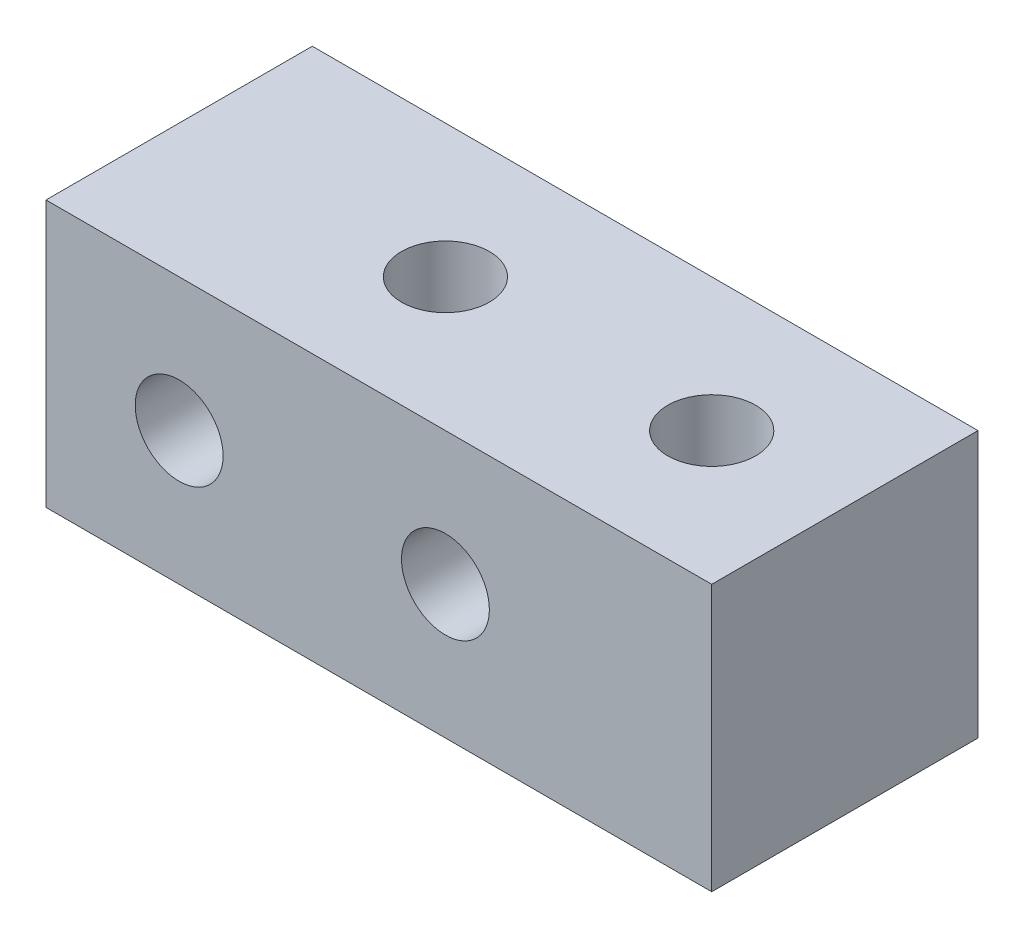
ISO-10303-21;
HEADER;
FILE_DESCRIPTION(('STEP AP214'),'2;1');
FILE_NAME('part.step','',(''),(''),'','','');
FILE_SCHEMA(('AUTOMOTIVE_DESIGN { 1 0 10303 214 1 1 1 1 }'));
ENDSEC;
DATA;
#1=APPLICATION_CONTEXT('core data for automotive mechanical design processes');
#2=APPLICATION_PROTOCOL_DEFINITION('international standard','automotive_design',2000,#1);
#3=PRODUCT_CONTEXT('',#1,'mechanical');
#4=PRODUCT('Part','Part','',(#3));
#5=PRODUCT_RELATED_PRODUCT_CATEGORY('part','',(#4));
#6=PRODUCT_DEFINITION_FORMATION('','',#4);
#7=PRODUCT_DEFINITION_CONTEXT('part definition',#1,'design');
#8=PRODUCT_DEFINITION('design','',#6,#7);
#9=PRODUCT_DEFINITION_SHAPE('','',#8);
#10=(LENGTH_UNIT() NAMED_UNIT(*) SI_UNIT(.MILLI.,.METRE.));
#11=(NAMED_UNIT(*) PLANE_ANGLE_UNIT() SI_UNIT($,.RADIAN.));
#12=(NAMED_UNIT(*) SI_UNIT($,.STERADIAN.) SOLID_ANGLE_UNIT());
#13=UNCERTAINTY_MEASURE_WITH_UNIT(LENGTH_MEASURE(1.E-05),#10,'distance_accuracy_value','');
#14=(GEOMETRIC_REPRESENTATION_CONTEXT(3) GLOBAL_UNCERTAINTY_ASSIGNED_CONTEXT((#13)) GLOBAL_UNIT_ASSIGNED_CONTEXT((#10,
#11,#12)) REPRESENTATION_CONTEXT('',''));
#15=CARTESIAN_POINT('',(0.,0.,0.));
#16=DIRECTION('',(0.,0.,1.));
#17=DIRECTION('',(1.,0.,0.));
#18=AXIS2_PLACEMENT_3D('',#15,#16,#17);
#19=CARTESIAN_POINT('',(-12.5,-5.,10.));
#20=DIRECTION('',(1.,0.,0.));
#21=DIRECTION('',(0.,0.,-1.));
#22=AXIS2_PLACEMENT_3D('',#19,#20,#21);
#23=PLANE('',#22);
#24=DIRECTION('',(0.,-1.,0.));
#25=VECTOR('',#24,1.);
#26=CARTESIAN_POINT('',(-12.5,-5.,0.));
#27=LINE('',#26,#25);
#28=CARTESIAN_POINT('',(-12.5,5.,0.));
#29=VERTEX_POINT('',#28);
#30=CARTESIAN_POINT('',(-12.5,-5.,0.));
#31=VERTEX_POINT('',#30);
#32=EDGE_CURVE('E99',#29,#31,#27,.T.);
#33=ORIENTED_EDGE('',*,*,#32,.T.);
#34=DIRECTION('',(0.,0.,-1.));
#35=VECTOR('',#34,1.);
#36=CARTESIAN_POINT('',(-12.5,-5.,10.));
#37=LINE('',#36,#35);
#38=CARTESIAN_POINT('',(-12.5,-5.,10.));
#39=VERTEX_POINT('',#38);
#40=EDGE_CURVE('E11',#39,#31,#37,.T.);
#41=ORIENTED_EDGE('',*,*,#40,.F.);
#42=DIRECTION('',(0.,-1.,0.));
#43=VECTOR('',#42,1.);
#44=CARTESIAN_POINT('',(-12.5,-5.,10.));
#45=LINE('',#44,#43);
#46=CARTESIAN_POINT('',(-12.5,5.,10.));
#47=VERTEX_POINT('',#46);
#48=EDGE_CURVE('E87',#47,#39,#45,.T.);
#49=ORIENTED_EDGE('',*,*,#48,.F.);
#50=DIRECTION('',(0.,0.,-1.));
#51=VECTOR('',#50,1.);
#52=CARTESIAN_POINT('',(-12.5,5.,10.));
#53=LINE('',#52,#51);
#54=EDGE_CURVE('E95',#47,#29,#53,.T.);
#55=ORIENTED_EDGE('',*,*,#54,.T.);
#56=EDGE_LOOP('',(#33,#41,#49,#55));
#57=FACE_BOUND('',#56,.T.);
#58=ADVANCED_FACE('F36',(#57),#23,.F.);
#59=CARTESIAN_POINT('',(12.5,-5.,10.));
#60=DIRECTION('',(0.,1.,0.));
#61=DIRECTION('',(-1.,0.,0.));
#62=AXIS2_PLACEMENT_3D('',#59,#60,#61);
#63=PLANE('',#62);
#64=CARTESIAN_POINT('',(-2.5,-5.,5.));
#65=DIRECTION('',(0.,1.,0.));
#66=DIRECTION('',(0.,0.,1.));
#67=AXIS2_PLACEMENT_3D('',#64,#65,#66);
#68=CIRCLE('',#67,1.65);
#69=CARTESIAN_POINT('',(-2.5,-5.,6.65));
#70=VERTEX_POINT('',#69);
#71=EDGE_CURVE('E130',#70,#70,#68,.T.);
#72=ORIENTED_EDGE('',*,*,#71,.T.);
#73=EDGE_LOOP('',(#72));
#74=FACE_BOUND('',#73,.T.);
#75=CARTESIAN_POINT('',(7.5,-5.,5.));
#76=DIRECTION('',(0.,1.,0.));
#77=DIRECTION('',(0.,0.,1.));
#78=AXIS2_PLACEMENT_3D('',#75,#76,#77);
#79=CIRCLE('',#78,1.65);
#80=CARTESIAN_POINT('',(7.5,-5.,6.65));
#81=VERTEX_POINT('',#80);
#82=EDGE_CURVE('E124',#81,#81,#79,.T.);
#83=ORIENTED_EDGE('',*,*,#82,.T.);
#84=EDGE_LOOP('',(#83));
#85=FACE_BOUND('',#84,.T.);
#86=DIRECTION('',(1.,0.,0.));
#87=VECTOR('',#86,1.);
#88=CARTESIAN_POINT('',(12.5,-5.,0.));
#89=LINE('',#88,#87);
#90=CARTESIAN_POINT('',(12.5,-5.,0.));
#91=VERTEX_POINT('',#90);
#92=EDGE_CURVE('E91',#31,#91,#89,.T.);
#93=ORIENTED_EDGE('',*,*,#92,.T.);
#94=DIRECTION('',(0.,0.,-1.));
#95=VECTOR('',#94,1.);
#96=CARTESIAN_POINT('',(12.5,-5.,10.));
#97=LINE('',#96,#95);
#98=CARTESIAN_POINT('',(12.5,-5.,10.));
#99=VERTEX_POINT('',#98);
#100=EDGE_CURVE('E44',#99,#91,#97,.T.);
#101=ORIENTED_EDGE('',*,*,#100,.F.);
#102=DIRECTION('',(1.,0.,0.));
#103=VECTOR('',#102,1.);
#104=CARTESIAN_POINT('',(12.5,-5.,10.));
#105=LINE('',#104,#103);
#106=EDGE_CURVE('E82',#39,#99,#105,.T.);
#107=ORIENTED_EDGE('',*,*,#106,.F.);
#108=ORIENTED_EDGE('',*,*,#40,.T.);
#109=EDGE_LOOP('',(#93,#101,#107,#108));
#110=FACE_BOUND('',#109,.T.);
#111=ADVANCED_FACE('F90',(#74,#85,#110),#63,.F.);
#112=CARTESIAN_POINT('',(12.5,-5.,10.));
#113=DIRECTION('',(-1.,0.,0.));
#114=DIRECTION('',(0.,0.,1.));
#115=AXIS2_PLACEMENT_3D('',#112,#113,#114);
#116=PLANE('',#115);
#117=DIRECTION('',(0.,1.,0.));
#118=VECTOR('',#117,1.);
#119=CARTESIAN_POINT('',(12.5,-5.,0.));
#120=LINE('',#119,#118);
#121=CARTESIAN_POINT('',(12.5,5.,0.));
#122=VERTEX_POINT('',#121);
#123=EDGE_CURVE('E69',#91,#122,#120,.T.);
#124=ORIENTED_EDGE('',*,*,#123,.T.);
#125=DIRECTION('',(0.,0.,-1.));
#126=VECTOR('',#125,1.);
#127=CARTESIAN_POINT('',(12.5,5.,10.));
#128=LINE('',#127,#126);
#129=CARTESIAN_POINT('',(12.5,5.,10.));
#130=VERTEX_POINT('',#129);
#131=EDGE_CURVE('E92',#130,#122,#128,.T.);
#132=ORIENTED_EDGE('',*,*,#131,.F.);
#133=DIRECTION('',(0.,1.,0.));
#134=VECTOR('',#133,1.);
#135=CARTESIAN_POINT('',(12.5,-5.,10.));
#136=LINE('',#135,#134);
#137=EDGE_CURVE('E85',#99,#130,#136,.T.);
#138=ORIENTED_EDGE('',*,*,#137,.F.);
#139=ORIENTED_EDGE('',*,*,#100,.T.);
#140=EDGE_LOOP('',(#124,#132,#138,#139));
#141=FACE_BOUND('',#140,.T.);
#142=ADVANCED_FACE('F93',(#141),#116,.F.);
#143=CARTESIAN_POINT('',(12.5,5.,10.));
#144=DIRECTION('',(0.,-1.,0.));
#145=DIRECTION('',(1.,0.,0.));
#146=AXIS2_PLACEMENT_3D('',#143,#144,#145);
#147=PLANE('',#146);
#148=CARTESIAN_POINT('',(-2.5,5.,5.));
#149=DIRECTION('',(0.,1.,0.));
#150=DIRECTION('',(0.,0.,1.));
#151=AXIS2_PLACEMENT_3D('',#148,#149,#150);
#152=CIRCLE('',#151,1.65);
#153=CARTESIAN_POINT('',(-2.5,5.,6.65));
#154=VERTEX_POINT('',#153);
#155=EDGE_CURVE('E133',#154,#154,#152,.T.);
#156=ORIENTED_EDGE('',*,*,#155,.F.);
#157=EDGE_LOOP('',(#156));
#158=FACE_BOUND('',#157,.T.);
#159=CARTESIAN_POINT('',(7.5,5.,5.));
#160=DIRECTION('',(0.,1.,0.));
#161=DIRECTION('',(0.,0.,1.));
#162=AXIS2_PLACEMENT_3D('',#159,#160,#161);
#163=CIRCLE('',#162,1.65);
#164=CARTESIAN_POINT('',(7.5,5.,6.65));
#165=VERTEX_POINT('',#164);
#166=EDGE_CURVE('E127',#165,#165,#163,.T.);
#167=ORIENTED_EDGE('',*,*,#166,.F.);
#168=EDGE_LOOP('',(#167));
#169=FACE_BOUND('',#168,.T.);
#170=DIRECTION('',(-1.,0.,0.));
#171=VECTOR('',#170,1.);
#172=CARTESIAN_POINT('',(12.5,5.,0.));
#173=LINE('',#172,#171);
#174=EDGE_CURVE('E75',#122,#29,#173,.T.);
#175=ORIENTED_EDGE('',*,*,#174,.T.);
#176=ORIENTED_EDGE('',*,*,#54,.F.);
#177=DIRECTION('',(-1.,0.,0.));
#178=VECTOR('',#177,1.);
#179=CARTESIAN_POINT('',(12.5,5.,10.));
#180=LINE('',#179,#178);
#181=EDGE_CURVE('E52',#130,#47,#180,.T.);
#182=ORIENTED_EDGE('',*,*,#181,.F.);
#183=ORIENTED_EDGE('',*,*,#131,.T.);
#184=EDGE_LOOP('',(#175,#176,#182,#183));
#185=FACE_BOUND('',#184,.T.);
#186=ADVANCED_FACE('F107',(#158,#169,#185),#147,.F.);
#187=CARTESIAN_POINT('',(0.,0.,10.));
#188=DIRECTION('',(0.,0.,1.));
#189=DIRECTION('',(1.,0.,0.));
#190=AXIS2_PLACEMENT_3D('',#187,#188,#189);
#191=PLANE('',#190);
#192=CARTESIAN_POINT('',(2.5,0.,10.));
#193=DIRECTION('',(0.,0.,1.));
#194=DIRECTION('',(1.,0.,0.));
#195=AXIS2_PLACEMENT_3D('',#192,#193,#194);
#196=CIRCLE('',#195,1.65);
#197=CARTESIAN_POINT('',(4.15,0.,10.));
#198=VERTEX_POINT('',#197);
#199=EDGE_CURVE('E121',#198,#198,#196,.T.);
#200=ORIENTED_EDGE('',*,*,#199,.F.);
#201=EDGE_LOOP('',(#200));
#202=FACE_BOUND('',#201,.T.);
#203=CARTESIAN_POINT('',(-7.5,0.,10.));
#204=DIRECTION('',(0.,0.,1.));
#205=DIRECTION('',(1.,0.,0.));
#206=AXIS2_PLACEMENT_3D('',#203,#204,#205);
#207=CIRCLE('',#206,1.65);
#208=CARTESIAN_POINT('',(-5.85,0.,10.));
#209=VERTEX_POINT('',#208);
#210=EDGE_CURVE('E115',#209,#209,#207,.T.);
#211=ORIENTED_EDGE('',*,*,#210,.F.);
#212=EDGE_LOOP('',(#211));
#213=FACE_BOUND('',#212,.T.);
#214=ORIENTED_EDGE('',*,*,#48,.T.);
#215=ORIENTED_EDGE('',*,*,#106,.T.);
#216=ORIENTED_EDGE('',*,*,#137,.T.);
#217=ORIENTED_EDGE('',*,*,#181,.T.);
#218=EDGE_LOOP('',(#214,#215,#216,#217));
#219=FACE_BOUND('',#218,.T.);
#220=ADVANCED_FACE('F83',(#202,#213,#219),#191,.T.);
#221=CARTESIAN_POINT('',(0.,0.,0.));
#222=DIRECTION('',(0.,0.,1.));
#223=DIRECTION('',(1.,0.,0.));
#224=AXIS2_PLACEMENT_3D('',#221,#222,#223);
#225=PLANE('',#224);
#226=CARTESIAN_POINT('',(2.5,0.,0.));
#227=DIRECTION('',(0.,0.,1.));
#228=DIRECTION('',(1.,0.,0.));
#229=AXIS2_PLACEMENT_3D('',#226,#227,#228);
#230=CIRCLE('',#229,1.65);
#231=CARTESIAN_POINT('',(4.15,0.,0.));
#232=VERTEX_POINT('',#231);
#233=EDGE_CURVE('E118',#232,#232,#230,.T.);
#234=ORIENTED_EDGE('',*,*,#233,.T.);
#235=EDGE_LOOP('',(#234));
#236=FACE_BOUND('',#235,.T.);
#237=CARTESIAN_POINT('',(-7.5,0.,0.));
#238=DIRECTION('',(0.,0.,1.));
#239=DIRECTION('',(1.,0.,0.));
#240=AXIS2_PLACEMENT_3D('',#237,#238,#239);
#241=CIRCLE('',#240,1.65);
#242=CARTESIAN_POINT('',(-5.85,0.,0.));
#243=VERTEX_POINT('',#242);
#244=EDGE_CURVE('E102',#243,#243,#241,.T.);
#245=ORIENTED_EDGE('',*,*,#244,.T.);
#246=EDGE_LOOP('',(#245));
#247=FACE_BOUND('',#246,.T.);
#248=ORIENTED_EDGE('',*,*,#32,.F.);
#249=ORIENTED_EDGE('',*,*,#174,.F.);
#250=ORIENTED_EDGE('',*,*,#123,.F.);
#251=ORIENTED_EDGE('',*,*,#92,.F.);
#252=EDGE_LOOP('',(#248,#249,#250,#251));
#253=FACE_BOUND('',#252,.T.);
#254=ADVANCED_FACE('F110',(#236,#247,#253),#225,.F.);
#255=CARTESIAN_POINT('',(-7.5,0.,10.));
#256=DIRECTION('',(0.,0.,1.));
#257=DIRECTION('',(1.,0.,0.));
#258=AXIS2_PLACEMENT_3D('',#255,#256,#257);
#259=CYLINDRICAL_SURFACE('',#258,1.65);
#260=ORIENTED_EDGE('',*,*,#244,.F.);
#261=EDGE_LOOP('',(#260));
#262=FACE_BOUND('',#261,.T.);
#263=ORIENTED_EDGE('',*,*,#210,.T.);
#264=EDGE_LOOP('',(#263));
#265=FACE_BOUND('',#264,.T.);
#266=ADVANCED_FACE('F155',(#262,#265),#259,.F.);
#267=CARTESIAN_POINT('',(2.5,0.,10.));
#268=DIRECTION('',(0.,0.,1.));
#269=DIRECTION('',(1.,0.,0.));
#270=AXIS2_PLACEMENT_3D('',#267,#268,#269);
#271=CYLINDRICAL_SURFACE('',#270,1.65);
#272=ORIENTED_EDGE('',*,*,#233,.F.);
#273=EDGE_LOOP('',(#272));
#274=FACE_BOUND('',#273,.T.);
#275=ORIENTED_EDGE('',*,*,#199,.T.);
#276=EDGE_LOOP('',(#275));
#277=FACE_BOUND('',#276,.T.);
#278=ADVANCED_FACE('F146',(#274,#277),#271,.F.);
#279=CARTESIAN_POINT('',(7.5,5.,5.));
#280=DIRECTION('',(0.,1.,0.));
#281=DIRECTION('',(0.,0.,1.));
#282=AXIS2_PLACEMENT_3D('',#279,#280,#281);
#283=CYLINDRICAL_SURFACE('',#282,1.65);
#284=ORIENTED_EDGE('',*,*,#82,.F.);
#285=EDGE_LOOP('',(#284));
#286=FACE_BOUND('',#285,.T.);
#287=ORIENTED_EDGE('',*,*,#166,.T.);
#288=EDGE_LOOP('',(#287));
#289=FACE_BOUND('',#288,.T.);
#290=ADVANCED_FACE('F144',(#286,#289),#283,.F.);
#291=CARTESIAN_POINT('',(-2.5,5.,5.));
#292=DIRECTION('',(0.,1.,0.));
#293=DIRECTION('',(0.,0.,1.));
#294=AXIS2_PLACEMENT_3D('',#291,#292,#293);
#295=CYLINDRICAL_SURFACE('',#294,1.65);
#296=ORIENTED_EDGE('',*,*,#71,.F.);
#297=EDGE_LOOP('',(#296));
#298=FACE_BOUND('',#297,.T.);
#299=ORIENTED_EDGE('',*,*,#155,.T.);
#300=EDGE_LOOP('',(#299));
#301=FACE_BOUND('',#300,.T.);
#302=ADVANCED_FACE('F137',(#298,#301),#295,.F.);
#303=CLOSED_SHELL('',(#58,#111,#142,#186,#220,#254,#266,#278,#290,#302));
#304=MANIFOLD_SOLID_BREP('B2',#303);
#305=ADVANCED_BREP_SHAPE_REPRESENTATION('',(#18,#304),#14);
#306=SHAPE_DEFINITION_REPRESENTATION(#9,#305);
ENDSEC;
END-ISO-10303-21;
